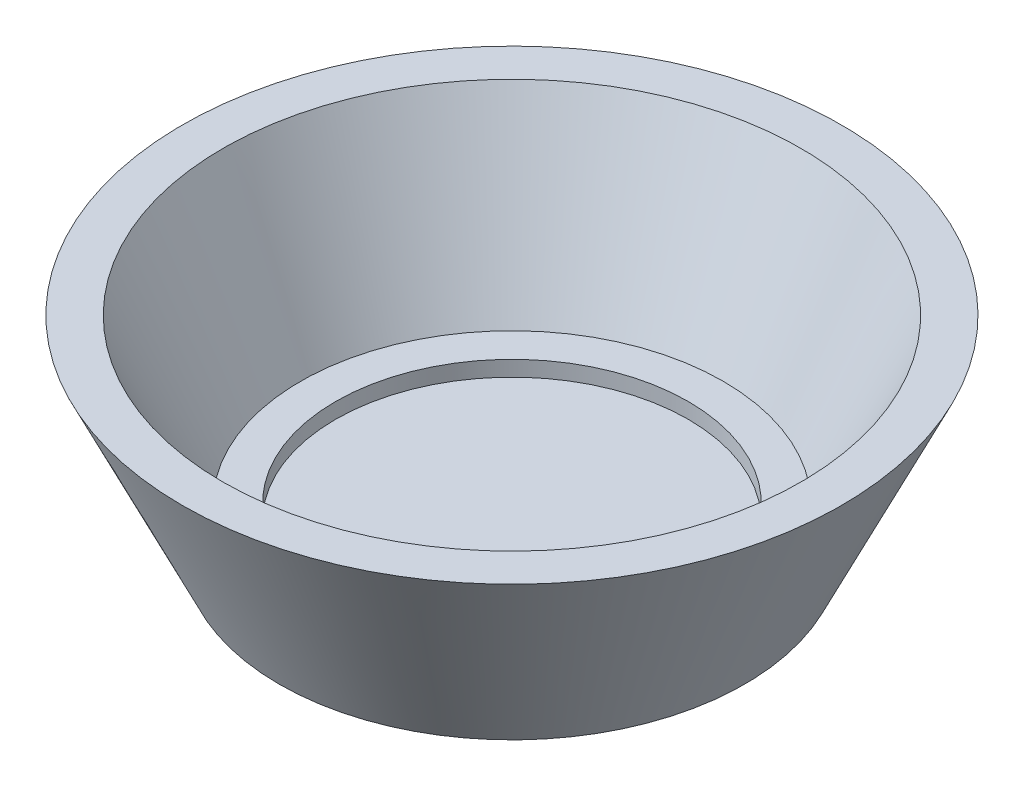
ISO-10303-21;
HEADER;
FILE_DESCRIPTION(('STEP AP214'),'2;1');
FILE_NAME('part.step','',(''),(''),'','','');
FILE_SCHEMA(('AUTOMOTIVE_DESIGN { 1 0 10303 214 1 1 1 1 }'));
ENDSEC;
DATA;
#1=APPLICATION_CONTEXT('core data for automotive mechanical design processes');
#2=APPLICATION_PROTOCOL_DEFINITION('international standard','automotive_design',2000,#1);
#3=PRODUCT_CONTEXT('',#1,'mechanical');
#4=PRODUCT('Part','Part','',(#3));
#5=PRODUCT_RELATED_PRODUCT_CATEGORY('part','',(#4));
#6=PRODUCT_DEFINITION_FORMATION('','',#4);
#7=PRODUCT_DEFINITION_CONTEXT('part definition',#1,'design');
#8=PRODUCT_DEFINITION('design','',#6,#7);
#9=PRODUCT_DEFINITION_SHAPE('','',#8);
#10=(LENGTH_UNIT() NAMED_UNIT(*) SI_UNIT(.MILLI.,.METRE.));
#11=(NAMED_UNIT(*) PLANE_ANGLE_UNIT() SI_UNIT($,.RADIAN.));
#12=(NAMED_UNIT(*) SI_UNIT($,.STERADIAN.) SOLID_ANGLE_UNIT());
#13=UNCERTAINTY_MEASURE_WITH_UNIT(LENGTH_MEASURE(1.E-05),#10,'distance_accuracy_value','');
#14=(GEOMETRIC_REPRESENTATION_CONTEXT(3) GLOBAL_UNCERTAINTY_ASSIGNED_CONTEXT((#13)) GLOBAL_UNIT_ASSIGNED_CONTEXT((#10,
#11,#12)) REPRESENTATION_CONTEXT('',''));
#15=CARTESIAN_POINT('',(0.,0.,0.));
#16=DIRECTION('',(0.,0.,1.));
#17=DIRECTION('',(1.,0.,0.));
#18=AXIS2_PLACEMENT_3D('',#15,#16,#17);
#19=CARTESIAN_POINT('',(0.,0.,0.));
#20=DIRECTION('',(0.,1.,0.));
#21=DIRECTION('',(0.,0.,1.));
#22=AXIS2_PLACEMENT_3D('',#19,#20,#21);
#23=PLANE('',#22);
#24=CARTESIAN_POINT('',(0.,0.,0.));
#25=DIRECTION('',(0.,1.,0.));
#26=DIRECTION('',(0.,0.,1.));
#27=AXIS2_PLACEMENT_3D('',#24,#25,#26);
#28=CIRCLE('',#27,75.2666996210249);
#29=CARTESIAN_POINT('',(0.,0.,75.2666996210249));
#30=VERTEX_POINT('',#29);
#31=EDGE_CURVE('E10',#30,#30,#28,.T.);
#32=ORIENTED_EDGE('',*,*,#31,.F.);
#33=EDGE_LOOP('',(#32));
#34=FACE_BOUND('',#33,.T.);
#35=ADVANCED_FACE('F35',(#34),#23,.F.);
#36=CARTESIAN_POINT('',(0.,0.,0.));
#37=DIRECTION('',(0.,1.,0.));
#38=DIRECTION('',(0.,0.,1.));
#39=AXIS2_PLACEMENT_3D('',#36,#37,#38);
#40=CONICAL_SURFACE('',#39,75.2666996210249,0.444735390429651);
#41=CARTESIAN_POINT('',(0.,65.7579172845609,0.));
#42=DIRECTION('',(0.,1.,0.));
#43=DIRECTION('',(0.,0.,1.));
#44=AXIS2_PLACEMENT_3D('',#41,#42,#43);
#45=CIRCLE('',#44,106.605503377822);
#46=CARTESIAN_POINT('',(0.,65.7579172845609,106.605503377822));
#47=VERTEX_POINT('',#46);
#48=EDGE_CURVE('E41',#47,#47,#45,.T.);
#49=ORIENTED_EDGE('',*,*,#48,.F.);
#50=EDGE_LOOP('',(#49));
#51=FACE_BOUND('',#50,.T.);
#52=ORIENTED_EDGE('',*,*,#31,.T.);
#53=EDGE_LOOP('',(#52));
#54=FACE_BOUND('',#53,.T.);
#55=ADVANCED_FACE('F83',(#51,#54),#40,.T.);
#56=CARTESIAN_POINT('',(106.605503377822,65.7579172845609,0.));
#57=DIRECTION('',(0.,-1.,0.));
#58=DIRECTION('',(0.,0.,-1.));
#59=AXIS2_PLACEMENT_3D('',#56,#57,#58);
#60=PLANE('',#59);
#61=CARTESIAN_POINT('',(0.,65.7579172845609,0.));
#62=DIRECTION('',(0.,1.,0.));
#63=DIRECTION('',(0.,0.,1.));
#64=AXIS2_PLACEMENT_3D('',#61,#62,#63);
#65=CIRCLE('',#64,93.4807052232658);
#66=CARTESIAN_POINT('',(0.,65.7579172845609,93.4807052232658));
#67=VERTEX_POINT('',#66);
#68=EDGE_CURVE('E45',#67,#67,#65,.T.);
#69=ORIENTED_EDGE('',*,*,#68,.F.);
#70=EDGE_LOOP('',(#69));
#71=FACE_BOUND('',#70,.T.);
#72=ORIENTED_EDGE('',*,*,#48,.T.);
#73=EDGE_LOOP('',(#72));
#74=FACE_BOUND('',#73,.T.);
#75=ADVANCED_FACE('F78',(#71,#74),#60,.F.);
#76=CARTESIAN_POINT('',(0.,65.7579172845609,0.));
#77=DIRECTION('',(0.,1.,0.));
#78=DIRECTION('',(0.,0.,1.));
#79=AXIS2_PLACEMENT_3D('',#76,#77,#78);
#80=CONICAL_SURFACE('',#79,93.4807052232658,0.444735390429651);
#81=CARTESIAN_POINT('',(0.,13.0625835343848,0.));
#82=DIRECTION('',(0.,1.,0.));
#83=DIRECTION('',(0.,0.,1.));
#84=AXIS2_PLACEMENT_3D('',#81,#82,#83);
#85=CIRCLE('',#84,68.367246776135);
#86=CARTESIAN_POINT('',(0.,13.0625835343848,68.367246776135));
#87=VERTEX_POINT('',#86);
#88=EDGE_CURVE('E49',#87,#87,#85,.T.);
#89=ORIENTED_EDGE('',*,*,#88,.F.);
#90=EDGE_LOOP('',(#89));
#91=FACE_BOUND('',#90,.T.);
#92=ORIENTED_EDGE('',*,*,#68,.T.);
#93=EDGE_LOOP('',(#92));
#94=FACE_BOUND('',#93,.T.);
#95=ADVANCED_FACE('F72',(#91,#94),#80,.F.);
#96=CARTESIAN_POINT('',(68.367246776135,13.0625835343848,0.));
#97=DIRECTION('',(0.,-1.,0.));
#98=DIRECTION('',(0.,0.,-1.));
#99=AXIS2_PLACEMENT_3D('',#96,#97,#98);
#100=PLANE('',#99);
#101=CARTESIAN_POINT('',(0.,13.0625835343848,0.));
#102=DIRECTION('',(0.,1.,0.));
#103=DIRECTION('',(0.,0.,1.));
#104=AXIS2_PLACEMENT_3D('',#101,#102,#103);
#105=CIRCLE('',#104,57.0493394946695);
#106=CARTESIAN_POINT('',(0.,13.0625835343848,57.0493394946695));
#107=VERTEX_POINT('',#106);
#108=EDGE_CURVE('E55',#107,#107,#105,.T.);
#109=ORIENTED_EDGE('',*,*,#108,.F.);
#110=EDGE_LOOP('',(#109));
#111=FACE_BOUND('',#110,.T.);
#112=ORIENTED_EDGE('',*,*,#88,.T.);
#113=EDGE_LOOP('',(#112));
#114=FACE_BOUND('',#113,.T.);
#115=ADVANCED_FACE('F66',(#111,#114),#100,.F.);
#116=CARTESIAN_POINT('',(0.,8.06258353438482,0.));
#117=DIRECTION('',(0.,1.,0.));
#118=DIRECTION('',(0.,0.,1.));
#119=AXIS2_PLACEMENT_3D('',#116,#117,#118);
#120=CYLINDRICAL_SURFACE('',#119,57.0493394946695);
#121=CARTESIAN_POINT('',(0.,8.06258353438482,0.));
#122=DIRECTION('',(0.,1.,0.));
#123=DIRECTION('',(0.,0.,1.));
#124=AXIS2_PLACEMENT_3D('',#121,#122,#123);
#125=CIRCLE('',#124,57.0493394946695);
#126=CARTESIAN_POINT('',(0.,8.06258353438482,57.0493394946695));
#127=VERTEX_POINT('',#126);
#128=EDGE_CURVE('E54',#127,#127,#125,.T.);
#129=ORIENTED_EDGE('',*,*,#128,.F.);
#130=EDGE_LOOP('',(#129));
#131=FACE_BOUND('',#130,.T.);
#132=ORIENTED_EDGE('',*,*,#108,.T.);
#133=EDGE_LOOP('',(#132));
#134=FACE_BOUND('',#133,.T.);
#135=ADVANCED_FACE('F63',(#131,#134),#120,.F.);
#136=CARTESIAN_POINT('',(0.,8.06258353438482,0.));
#137=DIRECTION('',(0.,1.,0.));
#138=DIRECTION('',(0.,0.,1.));
#139=AXIS2_PLACEMENT_3D('',#136,#137,#138);
#140=PLANE('',#139);
#141=ORIENTED_EDGE('',*,*,#128,.T.);
#142=EDGE_LOOP('',(#141));
#143=FACE_BOUND('',#142,.T.);
#144=ADVANCED_FACE('F61',(#143),#140,.T.);
#145=CLOSED_SHELL('',(#35,#55,#75,#95,#115,#135,#144));
#146=MANIFOLD_SOLID_BREP('B2',#145);
#147=ADVANCED_BREP_SHAPE_REPRESENTATION('',(#18,#146),#14);
#148=SHAPE_DEFINITION_REPRESENTATION(#9,#147);
ENDSEC;
END-ISO-10303-21;
